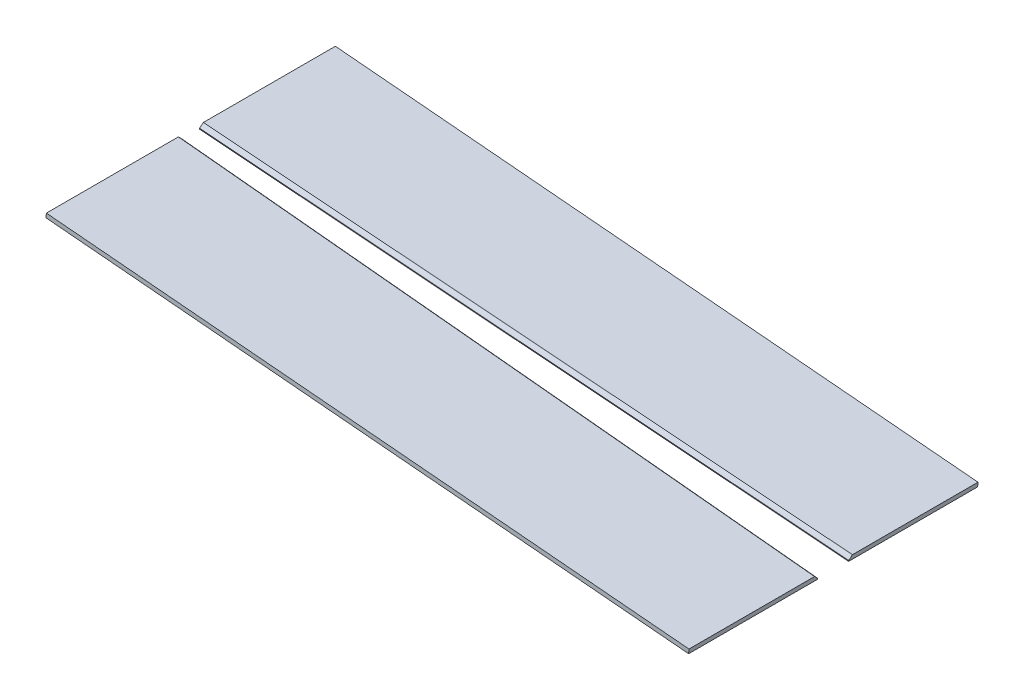
ISO-10303-21;
HEADER;
FILE_DESCRIPTION(('STEP AP214'),'2;1');
FILE_NAME('part.step','',(''),(''),'','','');
FILE_SCHEMA(('AUTOMOTIVE_DESIGN { 1 0 10303 214 1 1 1 1 }'));
ENDSEC;
DATA;
#1=APPLICATION_CONTEXT('core data for automotive mechanical design processes');
#2=APPLICATION_PROTOCOL_DEFINITION('international standard','automotive_design',2000,#1);
#3=PRODUCT_CONTEXT('',#1,'mechanical');
#4=PRODUCT('Part','Part','',(#3));
#5=PRODUCT_RELATED_PRODUCT_CATEGORY('part','',(#4));
#6=PRODUCT_DEFINITION_FORMATION('','',#4);
#7=PRODUCT_DEFINITION_CONTEXT('part definition',#1,'design');
#8=PRODUCT_DEFINITION('design','',#6,#7);
#9=PRODUCT_DEFINITION_SHAPE('','',#8);
#10=(LENGTH_UNIT() NAMED_UNIT(*) SI_UNIT(.MILLI.,.METRE.));
#11=(NAMED_UNIT(*) PLANE_ANGLE_UNIT() SI_UNIT($,.RADIAN.));
#12=(NAMED_UNIT(*) SI_UNIT($,.STERADIAN.) SOLID_ANGLE_UNIT());
#13=UNCERTAINTY_MEASURE_WITH_UNIT(LENGTH_MEASURE(1.E-05),#10,'distance_accuracy_value','');
#14=(GEOMETRIC_REPRESENTATION_CONTEXT(3) GLOBAL_UNCERTAINTY_ASSIGNED_CONTEXT((#13)) GLOBAL_UNIT_ASSIGNED_CONTEXT((#10,
#11,#12)) REPRESENTATION_CONTEXT('',''));
#15=CARTESIAN_POINT('',(0.,0.,0.));
#16=DIRECTION('',(0.,0.,1.));
#17=DIRECTION('',(1.,0.,0.));
#18=AXIS2_PLACEMENT_3D('',#15,#16,#17);
#19=CARTESIAN_POINT('',(-746.710244855071,70.3477805511974,168.));
#20=DIRECTION('',(-0.996194698091746,0.0871557427476515,0.));
#21=DIRECTION('',(-0.0871557427476515,-0.996194698091746,0.));
#22=AXIS2_PLACEMENT_3D('',#19,#20,#21);
#23=PLANE('',#22);
#24=DIRECTION('',(0.,0.,-1.));
#25=VECTOR('',#24,1.);
#26=CARTESIAN_POINT('',(-746.710244855071,70.3477805511974,168.));
#27=LINE('',#26,#25);
#28=CARTESIAN_POINT('',(-746.710244855071,70.3477805511974,168.));
#29=VERTEX_POINT('',#28);
#30=CARTESIAN_POINT('',(-746.710244855071,70.3477805511974,14.5001999950006));
#31=VERTEX_POINT('',#30);
#32=EDGE_CURVE('E141',#29,#31,#27,.T.);
#33=ORIENTED_EDGE('',*,*,#32,.T.);
#34=DIRECTION('',(-0.0616268760635698,-0.704398416662448,-0.707124457751308));
#35=VECTOR('',#34,1.);
#36=CARTESIAN_POINT('',(-740.021050322906,146.805623917196,91.2539373006382));
#37=LINE('',#36,#35);
#38=CARTESIAN_POINT('',(-747.058867826062,66.3630017588302,10.4999999999999));
#39=VERTEX_POINT('',#38);
#40=EDGE_CURVE('E12',#31,#39,#37,.T.);
#41=ORIENTED_EDGE('',*,*,#40,.T.);
#42=DIRECTION('',(-0.0871557427476515,-0.996194698091746,0.));
#43=VECTOR('',#42,1.);
#44=CARTESIAN_POINT('',(-746.710244855071,70.3477805511974,10.4999999999999));
#45=LINE('',#44,#43);
#46=CARTESIAN_POINT('',(-747.14602356881,65.3668070607387,10.4999999999999));
#47=VERTEX_POINT('',#46);
#48=EDGE_CURVE('E102',#39,#47,#45,.T.);
#49=ORIENTED_EDGE('',*,*,#48,.T.);
#50=DIRECTION('',(0.,0.,-1.));
#51=VECTOR('',#50,1.);
#52=CARTESIAN_POINT('',(-747.14602356881,65.3668070607387,168.));
#53=LINE('',#52,#51);
#54=CARTESIAN_POINT('',(-747.14602356881,65.3668070607387,168.));
#55=VERTEX_POINT('',#54);
#56=EDGE_CURVE('E106',#55,#47,#53,.T.);
#57=ORIENTED_EDGE('',*,*,#56,.F.);
#58=DIRECTION('',(-0.0871557427476515,-0.996194698091746,0.));
#59=VECTOR('',#58,1.);
#60=CARTESIAN_POINT('',(-746.710244855071,70.3477805511974,168.));
#61=LINE('',#60,#59);
#62=EDGE_CURVE('E112',#29,#55,#61,.T.);
#63=ORIENTED_EDGE('',*,*,#62,.F.);
#64=EDGE_LOOP('',(#33,#41,#49,#57,#63));
#65=FACE_BOUND('',#64,.T.);
#66=ADVANCED_FACE('F54',(#65),#23,.T.);
#67=CARTESIAN_POINT('',(-597.28104014131,57.2744191390497,168.));
#68=DIRECTION('',(0.,0.,1.));
#69=DIRECTION('',(1.,0.,0.));
#70=AXIS2_PLACEMENT_3D('',#67,#68,#69);
#71=PLANE('',#70);
#72=DIRECTION('',(-0.996194698091746,0.0871557427476515,0.));
#73=VECTOR('',#72,1.);
#74=CARTESIAN_POINT('',(-597.716818855048,52.2934456485909,168.));
#75=LINE('',#74,#73);
#76=CARTESIAN_POINT('',(0.,0.,168.));
#77=VERTEX_POINT('',#76);
#78=EDGE_CURVE('E127',#77,#55,#75,.T.);
#79=ORIENTED_EDGE('',*,*,#78,.F.);
#80=DIRECTION('',(-0.0871557427476515,-0.996194698091746,0.));
#81=VECTOR('',#80,1.);
#82=CARTESIAN_POINT('',(0.435778713738258,4.98097349045873,168.));
#83=LINE('',#82,#81);
#84=CARTESIAN_POINT('',(0.435778713738258,4.98097349045873,168.));
#85=VERTEX_POINT('',#84);
#86=EDGE_CURVE('E161',#85,#77,#83,.T.);
#87=ORIENTED_EDGE('',*,*,#86,.F.);
#88=DIRECTION('',(-0.996194698091746,0.0871557427476516,0.));
#89=VECTOR('',#88,1.);
#90=CARTESIAN_POINT('',(-597.28104014131,57.2744191390497,168.));
#91=LINE('',#90,#89);
#92=EDGE_CURVE('E135',#85,#29,#91,.T.);
#93=ORIENTED_EDGE('',*,*,#92,.T.);
#94=ORIENTED_EDGE('',*,*,#62,.T.);
#95=EDGE_LOOP('',(#79,#87,#93,#94));
#96=FACE_BOUND('',#95,.T.);
#97=ADVANCED_FACE('F169',(#96),#71,.T.);
#98=CARTESIAN_POINT('',(0.435778713738258,4.98097349045873,168.));
#99=DIRECTION('',(0.996194698091746,-0.0871557427476515,0.));
#100=DIRECTION('',(0.0871557427476515,0.996194698091746,0.));
#101=AXIS2_PLACEMENT_3D('',#98,#99,#100);
#102=PLANE('',#101);
#103=DIRECTION('',(-0.0871557427476515,-0.996194698091746,0.));
#104=VECTOR('',#103,1.);
#105=CARTESIAN_POINT('',(0.435778713738276,4.98097349045873,18.));
#106=LINE('',#105,#104);
#107=CARTESIAN_POINT('',(0.0871557427476521,0.996194698091539,18.));
#108=VERTEX_POINT('',#107);
#109=CARTESIAN_POINT('',(0.,0.,18.));
#110=VERTEX_POINT('',#109);
#111=EDGE_CURVE('E117',#108,#110,#106,.T.);
#112=ORIENTED_EDGE('',*,*,#111,.F.);
#113=DIRECTION('',(0.0616268760635697,0.704398416662448,0.707124457751308));
#114=VECTOR('',#113,1.);
#115=CARTESIAN_POINT('',(6.79813921100826,77.703086743283,95.0037498100126));
#116=LINE('',#115,#114);
#117=CARTESIAN_POINT('',(0.435778713738276,4.98097349045873,22.0001999950006));
#118=VERTEX_POINT('',#117);
#119=EDGE_CURVE('E78',#108,#118,#116,.T.);
#120=ORIENTED_EDGE('',*,*,#119,.T.);
#121=DIRECTION('',(0.,0.,1.));
#122=VECTOR('',#121,1.);
#123=CARTESIAN_POINT('',(0.435778713738258,4.98097349045873,168.));
#124=LINE('',#123,#122);
#125=EDGE_CURVE('E129',#118,#85,#124,.T.);
#126=ORIENTED_EDGE('',*,*,#125,.T.);
#127=ORIENTED_EDGE('',*,*,#86,.T.);
#128=DIRECTION('',(0.,0.,1.));
#129=VECTOR('',#128,1.);
#130=CARTESIAN_POINT('',(0.,0.,168.));
#131=LINE('',#130,#129);
#132=EDGE_CURVE('E123',#110,#77,#131,.T.);
#133=ORIENTED_EDGE('',*,*,#132,.F.);
#134=EDGE_LOOP('',(#112,#120,#126,#127,#133));
#135=FACE_BOUND('',#134,.T.);
#136=ADVANCED_FACE('F158',(#135),#102,.T.);
#137=CARTESIAN_POINT('',(-597.281040141309,57.2744191390497,12.));
#138=DIRECTION('',(0.0099614489209226,-0.00087151385287321,-0.999950003749688));
#139=DIRECTION('',(-0.999950383499115,0.,-0.00996145270396626));
#140=AXIS2_PLACEMENT_3D('',#137,#138,#139);
#141=PLANE('',#140);
#142=ORIENTED_EDGE('',*,*,#48,.F.);
#143=DIRECTION('',(0.996144892092261,-0.087151385287321,0.00999950003749688));
#144=VECTOR('',#143,1.);
#145=CARTESIAN_POINT('',(0.0871557427476521,0.996194698091539,18.));
#146=LINE('',#145,#144);
#147=EDGE_CURVE('E122',#39,#108,#146,.T.);
#148=ORIENTED_EDGE('',*,*,#147,.T.);
#149=ORIENTED_EDGE('',*,*,#111,.T.);
#150=DIRECTION('',(0.99614489209226,-0.087151385287321,0.00999950003749688));
#151=VECTOR('',#150,1.);
#152=CARTESIAN_POINT('',(-597.716818855048,52.2934456485909,12.));
#153=LINE('',#152,#151);
#154=EDGE_CURVE('E115',#47,#110,#153,.T.);
#155=ORIENTED_EDGE('',*,*,#154,.F.);
#156=EDGE_LOOP('',(#142,#148,#149,#155));
#157=FACE_BOUND('',#156,.T.);
#158=ADVANCED_FACE('F116',(#157),#141,.T.);
#159=CARTESIAN_POINT('',(0.435778713738258,4.98097349045873,0.));
#160=DIRECTION('',(-0.0871557427476516,-0.996194698091746,0.));
#161=DIRECTION('',(0.996194698091746,-0.0871557427476516,0.));
#162=AXIS2_PLACEMENT_3D('',#159,#160,#161);
#163=PLANE('',#162);
#164=ORIENTED_EDGE('',*,*,#125,.F.);
#165=DIRECTION('',(-0.996144892092261,0.087151385287321,-0.00999950003749688));
#166=VECTOR('',#165,1.);
#167=CARTESIAN_POINT('',(-746.750090650755,70.3512666066089,14.4998000149991));
#168=LINE('',#167,#166);
#169=EDGE_CURVE('E64',#118,#31,#168,.T.);
#170=ORIENTED_EDGE('',*,*,#169,.T.);
#171=ORIENTED_EDGE('',*,*,#32,.F.);
#172=ORIENTED_EDGE('',*,*,#92,.F.);
#173=EDGE_LOOP('',(#164,#170,#171,#172));
#174=FACE_BOUND('',#173,.T.);
#175=ADVANCED_FACE('F172',(#174),#163,.F.);
#176=CARTESIAN_POINT('',(0.,0.,0.));
#177=DIRECTION('',(-0.0871557427476516,-0.996194698091746,0.));
#178=DIRECTION('',(0.996194698091746,-0.0871557427476516,0.));
#179=AXIS2_PLACEMENT_3D('',#176,#177,#178);
#180=PLANE('',#179);
#181=ORIENTED_EDGE('',*,*,#56,.T.);
#182=ORIENTED_EDGE('',*,*,#154,.T.);
#183=ORIENTED_EDGE('',*,*,#132,.T.);
#184=ORIENTED_EDGE('',*,*,#78,.T.);
#185=EDGE_LOOP('',(#181,#182,#183,#184));
#186=FACE_BOUND('',#185,.T.);
#187=ADVANCED_FACE('F126',(#186),#180,.T.);
#188=CARTESIAN_POINT('',(-597.6296631123,53.2896403466825,12.));
#189=DIRECTION('',(0.0686722247986435,0.703799773047508,-0.707071428498904));
#190=DIRECTION('',(-0.996144892092261,0.087151385287321,-0.00999950003749688));
#191=AXIS2_PLACEMENT_3D('',#188,#189,#190);
#192=PLANE('',#191);
#193=ORIENTED_EDGE('',*,*,#40,.F.);
#194=ORIENTED_EDGE('',*,*,#169,.F.);
#195=ORIENTED_EDGE('',*,*,#119,.F.);
#196=ORIENTED_EDGE('',*,*,#147,.F.);
#197=EDGE_LOOP('',(#193,#194,#195,#196));
#198=FACE_BOUND('',#197,.T.);
#199=ADVANCED_FACE('F57',(#198),#192,.T.);
#200=CLOSED_SHELL('',(#66,#97,#136,#158,#175,#187,#199));
#201=MANIFOLD_SOLID_BREP('B2',#200);
#202=CARTESIAN_POINT('',(0.435778713738299,4.98097349045873,-168.));
#203=DIRECTION('',(0.996194698091746,-0.0871557427476515,0.));
#204=DIRECTION('',(0.0871557427476515,0.996194698091746,0.));
#205=AXIS2_PLACEMENT_3D('',#202,#203,#204);
#206=PLANE('',#205);
#207=DIRECTION('',(0.,0.,1.));
#208=VECTOR('',#207,1.);
#209=CARTESIAN_POINT('',(0.435778713738299,4.98097349045873,-168.));
#210=LINE('',#209,#208);
#211=CARTESIAN_POINT('',(0.435778713738299,4.98097349045873,-168.));
#212=VERTEX_POINT('',#211);
#213=CARTESIAN_POINT('',(0.435778713738299,4.98097349045873,-22.0001999950002));
#214=VERTEX_POINT('',#213);
#215=EDGE_CURVE('E313',#212,#214,#210,.T.);
#216=ORIENTED_EDGE('',*,*,#215,.T.);
#217=DIRECTION('',(-0.0616268760635706,-0.704398416662457,0.7071244577513));
#218=VECTOR('',#217,1.);
#219=CARTESIAN_POINT('',(6.79813921100831,77.7030867432832,-95.0037498100106));
#220=LINE('',#219,#218);
#221=CARTESIAN_POINT('',(0.0871557427476925,0.99619469809174,-18.));
#222=VERTEX_POINT('',#221);
#223=EDGE_CURVE('E52',#214,#222,#220,.T.);
#224=ORIENTED_EDGE('',*,*,#223,.T.);
#225=DIRECTION('',(-0.0871557427476515,-0.996194698091746,0.));
#226=VECTOR('',#225,1.);
#227=CARTESIAN_POINT('',(0.435778713738299,4.98097349045873,-18.));
#228=LINE('',#227,#226);
#229=CARTESIAN_POINT('',(0.,0.,-18.));
#230=VERTEX_POINT('',#229);
#231=EDGE_CURVE('E326',#222,#230,#228,.T.);
#232=ORIENTED_EDGE('',*,*,#231,.T.);
#233=DIRECTION('',(0.,0.,1.));
#234=VECTOR('',#233,1.);
#235=CARTESIAN_POINT('',(0.,0.,-168.));
#236=LINE('',#235,#234);
#237=CARTESIAN_POINT('',(0.,0.,-168.));
#238=VERTEX_POINT('',#237);
#239=EDGE_CURVE('E333',#238,#230,#236,.T.);
#240=ORIENTED_EDGE('',*,*,#239,.F.);
#241=DIRECTION('',(-0.0871557427476515,-0.996194698091746,0.));
#242=VECTOR('',#241,1.);
#243=CARTESIAN_POINT('',(0.435778713738299,4.98097349045873,-168.));
#244=LINE('',#243,#242);
#245=EDGE_CURVE('E321',#212,#238,#244,.T.);
#246=ORIENTED_EDGE('',*,*,#245,.F.);
#247=EDGE_LOOP('',(#216,#224,#232,#240,#246));
#248=FACE_BOUND('',#247,.T.);
#249=ADVANCED_FACE('F258',(#248),#206,.T.);
#250=CARTESIAN_POINT('',(-597.281040141309,57.2744191390497,-168.));
#251=DIRECTION('',(0.,0.,-1.));
#252=DIRECTION('',(-1.,0.,0.));
#253=AXIS2_PLACEMENT_3D('',#250,#251,#252);
#254=PLANE('',#253);
#255=DIRECTION('',(0.996194698091746,-0.0871557427476515,0.));
#256=VECTOR('',#255,1.);
#257=CARTESIAN_POINT('',(-597.716818855048,52.2934456485909,-168.));
#258=LINE('',#257,#256);
#259=CARTESIAN_POINT('',(-747.14602356881,65.3668070607387,-168.));
#260=VERTEX_POINT('',#259);
#261=EDGE_CURVE('E319',#260,#238,#258,.T.);
#262=ORIENTED_EDGE('',*,*,#261,.F.);
#263=DIRECTION('',(-0.0871557427476515,-0.996194698091746,0.));
#264=VECTOR('',#263,1.);
#265=CARTESIAN_POINT('',(-746.710244855071,70.3477805511974,-168.));
#266=LINE('',#265,#264);
#267=CARTESIAN_POINT('',(-746.710244855071,70.3477805511974,-168.));
#268=VERTEX_POINT('',#267);
#269=EDGE_CURVE('E308',#268,#260,#266,.T.);
#270=ORIENTED_EDGE('',*,*,#269,.F.);
#271=DIRECTION('',(0.996194698091746,-0.0871557427476515,0.));
#272=VECTOR('',#271,1.);
#273=CARTESIAN_POINT('',(-597.281040141309,57.2744191390497,-168.));
#274=LINE('',#273,#272);
#275=EDGE_CURVE('E312',#268,#212,#274,.T.);
#276=ORIENTED_EDGE('',*,*,#275,.T.);
#277=ORIENTED_EDGE('',*,*,#245,.T.);
#278=EDGE_LOOP('',(#262,#270,#276,#277));
#279=FACE_BOUND('',#278,.T.);
#280=ADVANCED_FACE('F316',(#279),#254,.T.);
#281=CARTESIAN_POINT('',(-746.710244855071,70.3477805511974,-168.));
#282=DIRECTION('',(-0.996194698091746,0.0871557427476515,0.));
#283=DIRECTION('',(-0.0871557427476515,-0.996194698091746,0.));
#284=AXIS2_PLACEMENT_3D('',#281,#282,#283);
#285=PLANE('',#284);
#286=DIRECTION('',(-0.0871557427476515,-0.996194698091746,0.));
#287=VECTOR('',#286,1.);
#288=CARTESIAN_POINT('',(-746.710244855071,70.3477805511974,-10.5000000000002));
#289=LINE('',#288,#287);
#290=CARTESIAN_POINT('',(-747.058867826062,66.3630017588304,-10.5000000000002));
#291=VERTEX_POINT('',#290);
#292=CARTESIAN_POINT('',(-747.14602356881,65.3668070607387,-10.5000000000002));
#293=VERTEX_POINT('',#292);
#294=EDGE_CURVE('E322',#291,#293,#289,.T.);
#295=ORIENTED_EDGE('',*,*,#294,.F.);
#296=DIRECTION('',(0.0616268760635706,0.704398416662457,-0.7071244577513));
#297=VECTOR('',#296,1.);
#298=CARTESIAN_POINT('',(-740.021050322906,146.805623917197,-91.2539373006362));
#299=LINE('',#298,#297);
#300=CARTESIAN_POINT('',(-746.710244855071,70.3477805511974,-14.5001999950004));
#301=VERTEX_POINT('',#300);
#302=EDGE_CURVE('E282',#291,#301,#299,.T.);
#303=ORIENTED_EDGE('',*,*,#302,.T.);
#304=DIRECTION('',(0.,0.,-1.));
#305=VECTOR('',#304,1.);
#306=CARTESIAN_POINT('',(-746.710244855071,70.3477805511974,-168.));
#307=LINE('',#306,#305);
#308=EDGE_CURVE('E304',#301,#268,#307,.T.);
#309=ORIENTED_EDGE('',*,*,#308,.T.);
#310=ORIENTED_EDGE('',*,*,#269,.T.);
#311=DIRECTION('',(0.,0.,-1.));
#312=VECTOR('',#311,1.);
#313=CARTESIAN_POINT('',(-747.14602356881,65.3668070607387,-168.));
#314=LINE('',#313,#312);
#315=EDGE_CURVE('E341',#293,#260,#314,.T.);
#316=ORIENTED_EDGE('',*,*,#315,.F.);
#317=EDGE_LOOP('',(#295,#303,#309,#310,#316));
#318=FACE_BOUND('',#317,.T.);
#319=ADVANCED_FACE('F306',(#318),#285,.T.);
#320=CARTESIAN_POINT('',(-597.281040141309,57.2744191390497,-12.0000000000001));
#321=DIRECTION('',(0.0099614489209223,-0.000871513852873183,0.999950003749688));
#322=DIRECTION('',(0.999950383499115,0.,-0.00996145270396596));
#323=AXIS2_PLACEMENT_3D('',#320,#321,#322);
#324=PLANE('',#323);
#325=ORIENTED_EDGE('',*,*,#231,.F.);
#326=DIRECTION('',(-0.996144892092261,0.087151385287321,0.00999950003749657));
#327=VECTOR('',#326,1.);
#328=CARTESIAN_POINT('',(-747.058867826062,66.3630017588304,-10.5000000000002));
#329=LINE('',#328,#327);
#330=EDGE_CURVE('E347',#222,#291,#329,.T.);
#331=ORIENTED_EDGE('',*,*,#330,.T.);
#332=ORIENTED_EDGE('',*,*,#294,.T.);
#333=DIRECTION('',(-0.99614489209226,0.087151385287321,0.00999950003749657));
#334=VECTOR('',#333,1.);
#335=CARTESIAN_POINT('',(-597.716818855048,52.2934456485909,-12.0000000000001));
#336=LINE('',#335,#334);
#337=EDGE_CURVE('E337',#230,#293,#336,.T.);
#338=ORIENTED_EDGE('',*,*,#337,.F.);
#339=EDGE_LOOP('',(#325,#331,#332,#338));
#340=FACE_BOUND('',#339,.T.);
#341=ADVANCED_FACE('F367',(#340),#324,.T.);
#342=CARTESIAN_POINT('',(0.435778713738257,4.98097349045872,0.));
#343=DIRECTION('',(-0.0871557427476516,-0.996194698091746,0.));
#344=DIRECTION('',(0.996194698091746,-0.0871557427476516,0.));
#345=AXIS2_PLACEMENT_3D('',#342,#343,#344);
#346=PLANE('',#345);
#347=ORIENTED_EDGE('',*,*,#308,.F.);
#348=DIRECTION('',(0.996144892092261,-0.087151385287321,-0.00999950003749657));
#349=VECTOR('',#348,1.);
#350=CARTESIAN_POINT('',(0.395932918054609,4.98445954587021,-21.9998000149987));
#351=LINE('',#350,#349);
#352=EDGE_CURVE('E268',#301,#214,#351,.T.);
#353=ORIENTED_EDGE('',*,*,#352,.T.);
#354=ORIENTED_EDGE('',*,*,#215,.F.);
#355=ORIENTED_EDGE('',*,*,#275,.F.);
#356=EDGE_LOOP('',(#347,#353,#354,#355));
#357=FACE_BOUND('',#356,.T.);
#358=ADVANCED_FACE('F324',(#357),#346,.F.);
#359=CARTESIAN_POINT('',(0.,0.,0.));
#360=DIRECTION('',(-0.0871557427476516,-0.996194698091746,0.));
#361=DIRECTION('',(0.996194698091746,-0.0871557427476516,0.));
#362=AXIS2_PLACEMENT_3D('',#359,#360,#361);
#363=PLANE('',#362);
#364=ORIENTED_EDGE('',*,*,#239,.T.);
#365=ORIENTED_EDGE('',*,*,#337,.T.);
#366=ORIENTED_EDGE('',*,*,#315,.T.);
#367=ORIENTED_EDGE('',*,*,#261,.T.);
#368=EDGE_LOOP('',(#364,#365,#366,#367));
#369=FACE_BOUND('',#368,.T.);
#370=ADVANCED_FACE('F372',(#369),#363,.T.);
#371=CARTESIAN_POINT('',(-597.6296631123,53.2896403466827,-12.0000000000001));
#372=DIRECTION('',(0.0686722247986426,0.703799773047499,0.707071428498913));
#373=DIRECTION('',(0.996144892092261,-0.087151385287321,-0.00999950003749657));
#374=AXIS2_PLACEMENT_3D('',#371,#372,#373);
#375=PLANE('',#374);
#376=ORIENTED_EDGE('',*,*,#223,.F.);
#377=ORIENTED_EDGE('',*,*,#352,.F.);
#378=ORIENTED_EDGE('',*,*,#302,.F.);
#379=ORIENTED_EDGE('',*,*,#330,.F.);
#380=EDGE_LOOP('',(#376,#377,#378,#379));
#381=FACE_BOUND('',#380,.T.);
#382=ADVANCED_FACE('F261',(#381),#375,.T.);
#383=CLOSED_SHELL('',(#249,#280,#319,#341,#358,#370,#382));
#384=MANIFOLD_SOLID_BREP('B6',#383);
#385=ADVANCED_BREP_SHAPE_REPRESENTATION('',(#18,#201,#384),#14);
#386=SHAPE_DEFINITION_REPRESENTATION(#9,#385);
ENDSEC;
END-ISO-10303-21;
